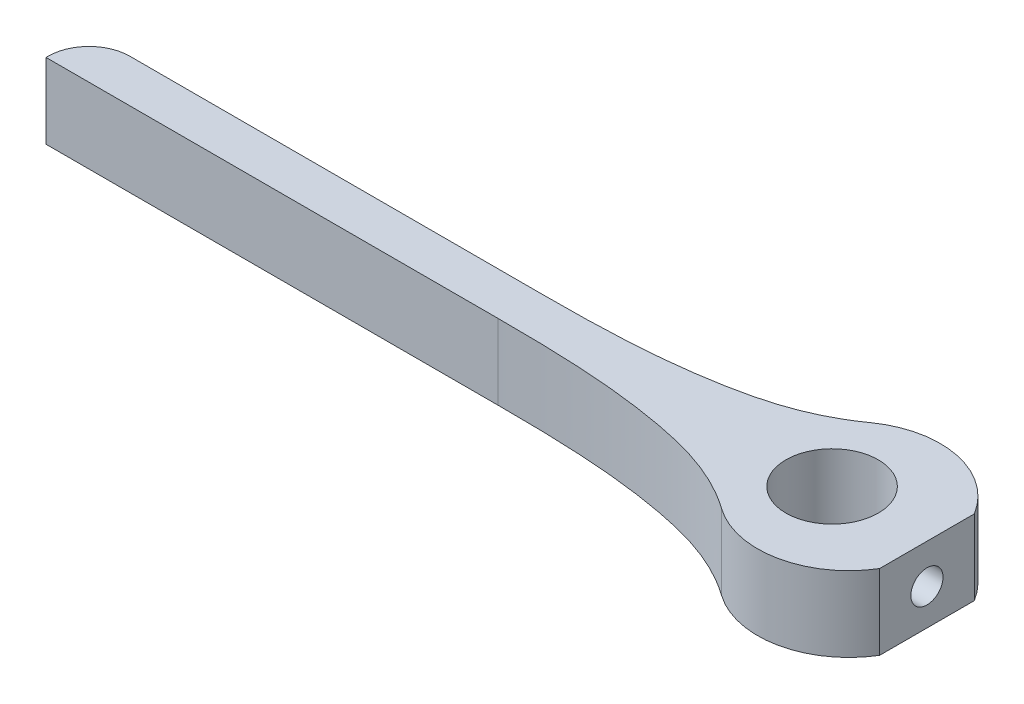
ISO-10303-21;
HEADER;
FILE_DESCRIPTION(('STEP AP214'),'2;1');
FILE_NAME('part.step','',(''),(''),'','','');
FILE_SCHEMA(('AUTOMOTIVE_DESIGN { 1 0 10303 214 1 1 1 1 }'));
ENDSEC;
DATA;
#1=APPLICATION_CONTEXT('core data for automotive mechanical design processes');
#2=APPLICATION_PROTOCOL_DEFINITION('international standard','automotive_design',2000,#1);
#3=PRODUCT_CONTEXT('',#1,'mechanical');
#4=PRODUCT('Part','Part','',(#3));
#5=PRODUCT_RELATED_PRODUCT_CATEGORY('part','',(#4));
#6=PRODUCT_DEFINITION_FORMATION('','',#4);
#7=PRODUCT_DEFINITION_CONTEXT('part definition',#1,'design');
#8=PRODUCT_DEFINITION('design','',#6,#7);
#9=PRODUCT_DEFINITION_SHAPE('','',#8);
#10=(LENGTH_UNIT() NAMED_UNIT(*) SI_UNIT(.MILLI.,.METRE.));
#11=(NAMED_UNIT(*) PLANE_ANGLE_UNIT() SI_UNIT($,.RADIAN.));
#12=(NAMED_UNIT(*) SI_UNIT($,.STERADIAN.) SOLID_ANGLE_UNIT());
#13=UNCERTAINTY_MEASURE_WITH_UNIT(LENGTH_MEASURE(1.E-05),#10,'distance_accuracy_value','');
#14=(GEOMETRIC_REPRESENTATION_CONTEXT(3) GLOBAL_UNCERTAINTY_ASSIGNED_CONTEXT((#13)) GLOBAL_UNIT_ASSIGNED_CONTEXT((#10,
#11,#12)) REPRESENTATION_CONTEXT('',''));
#15=CARTESIAN_POINT('',(0.,0.,0.));
#16=DIRECTION('',(0.,0.,1.));
#17=DIRECTION('',(1.,0.,0.));
#18=AXIS2_PLACEMENT_3D('',#15,#16,#17);
#19=CARTESIAN_POINT('',(0.,7.,0.));
#20=DIRECTION('',(0.,-1.,0.));
#21=DIRECTION('',(0.,0.,-1.));
#22=AXIS2_PLACEMENT_3D('',#19,#20,#21);
#23=CYLINDRICAL_SURFACE('',#22,4.3);
#24=CARTESIAN_POINT('',(0.,0.,0.));
#25=DIRECTION('',(0.,1.,0.));
#26=DIRECTION('',(0.,0.,1.));
#27=AXIS2_PLACEMENT_3D('',#24,#25,#26);
#28=CIRCLE('',#27,4.3);
#29=CARTESIAN_POINT('',(0.,0.,4.3));
#30=VERTEX_POINT('',#29);
#31=EDGE_CURVE('E150',#30,#30,#28,.T.);
#32=ORIENTED_EDGE('',*,*,#31,.F.);
#33=EDGE_LOOP('',(#32));
#34=FACE_BOUND('',#33,.T.);
#35=CARTESIAN_POINT('',(0.,7.,0.));
#36=DIRECTION('',(0.,1.,0.));
#37=DIRECTION('',(0.,0.,1.));
#38=AXIS2_PLACEMENT_3D('',#35,#36,#37);
#39=CIRCLE('',#38,4.3);
#40=CARTESIAN_POINT('',(0.,7.,4.3));
#41=VERTEX_POINT('',#40);
#42=EDGE_CURVE('E184',#41,#41,#39,.T.);
#43=ORIENTED_EDGE('',*,*,#42,.T.);
#44=EDGE_LOOP('',(#43));
#45=FACE_BOUND('',#44,.T.);
#46=CARTESIAN_POINT('',(0.,8.95497814287192,0.));
#47=DIRECTION('',(0.,-0.499999999999999,-0.866025403784439));
#48=DIRECTION('',(0.,-0.866025403784439,0.5));
#49=AXIS2_PLACEMENT_3D('',#46,#47,#48);
#50=ELLIPSE('',#49,8.60000000000001,4.3);
#51=CARTESIAN_POINT('',(3.98498738923209,6.1568311626395,1.61551091226932));
#52=VERTEX_POINT('',#51);
#53=CARTESIAN_POINT('',(2.83733994603308,3.35868418240708,3.23102182453865));
#54=VERTEX_POINT('',#53);
#55=EDGE_CURVE('E201',#52,#54,#50,.T.);
#56=ORIENTED_EDGE('',*,*,#55,.T.);
#57=CARTESIAN_POINT('',(0.,-2.23760977805774,0.));
#58=DIRECTION('',(0.,0.5,-0.866025403784439));
#59=DIRECTION('',(0.,-0.866025403784439,-0.5));
#60=AXIS2_PLACEMENT_3D('',#57,#58,#59);
#61=ELLIPSE('',#60,8.6,4.3);
#62=CARTESIAN_POINT('',(3.98498738923208,0.560537202174673,1.61551091226932));
#63=VERTEX_POINT('',#62);
#64=EDGE_CURVE('E11',#54,#63,#61,.T.);
#65=ORIENTED_EDGE('',*,*,#64,.T.);
#66=CARTESIAN_POINT('',(0.,0.560537202174673,0.));
#67=DIRECTION('',(0.,1.,0.));
#68=DIRECTION('',(0.,0.,1.));
#69=AXIS2_PLACEMENT_3D('',#66,#67,#68);
#70=CIRCLE('',#69,4.3);
#71=CARTESIAN_POINT('',(3.98498738923209,0.560537202174673,-1.61551091226932));
#72=VERTEX_POINT('',#71);
#73=EDGE_CURVE('E42',#63,#72,#70,.T.);
#74=ORIENTED_EDGE('',*,*,#73,.T.);
#75=CARTESIAN_POINT('',(0.,-2.23760977805774,0.));
#76=DIRECTION('',(0.,0.499999999999999,0.866025403784439));
#77=DIRECTION('',(0.,-0.866025403784439,0.5));
#78=AXIS2_PLACEMENT_3D('',#75,#76,#77);
#79=ELLIPSE('',#78,8.60000000000001,4.3);
#80=CARTESIAN_POINT('',(2.83733994603308,3.35868418240709,-3.23102182453864));
#81=VERTEX_POINT('',#80);
#82=EDGE_CURVE('E214',#72,#81,#79,.T.);
#83=ORIENTED_EDGE('',*,*,#82,.T.);
#84=CARTESIAN_POINT('',(0.,8.9549781428719,0.));
#85=DIRECTION('',(0.,-0.5,0.866025403784438));
#86=DIRECTION('',(0.,-0.866025403784439,-0.5));
#87=AXIS2_PLACEMENT_3D('',#84,#85,#86);
#88=ELLIPSE('',#87,8.6,4.3);
#89=CARTESIAN_POINT('',(3.98498738923209,6.1568311626395,-1.61551091226932));
#90=VERTEX_POINT('',#89);
#91=EDGE_CURVE('E211',#81,#90,#88,.T.);
#92=ORIENTED_EDGE('',*,*,#91,.T.);
#93=CARTESIAN_POINT('',(0.,6.1568311626395,0.));
#94=DIRECTION('',(0.,-1.,0.));
#95=DIRECTION('',(0.,0.,-1.));
#96=AXIS2_PLACEMENT_3D('',#93,#94,#95);
#97=CIRCLE('',#96,4.3);
#98=EDGE_CURVE('E208',#90,#52,#97,.T.);
#99=ORIENTED_EDGE('',*,*,#98,.T.);
#100=EDGE_LOOP('',(#56,#65,#74,#83,#92,#99));
#101=FACE_BOUND('',#100,.T.);
#102=ADVANCED_FACE('F35',(#34,#45,#101),#23,.F.);
#103=CARTESIAN_POINT('',(0.,7.,2.00000000000002));
#104=DIRECTION('',(0.,0.,-1.));
#105=DIRECTION('',(-1.,0.,0.));
#106=AXIS2_PLACEMENT_3D('',#103,#104,#105);
#107=PLANE('',#106);
#108=DIRECTION('',(1.,0.,0.));
#109=VECTOR('',#108,1.);
#110=CARTESIAN_POINT('',(0.,0.,2.00000000000002));
#111=LINE('',#110,#109);
#112=CARTESIAN_POINT('',(-71.1704335355529,0.,2.00000000000002));
#113=VERTEX_POINT('',#112);
#114=CARTESIAN_POINT('',(-29.0823518773819,0.,2.00000000000002));
#115=VERTEX_POINT('',#114);
#116=EDGE_CURVE('E153',#113,#115,#111,.T.);
#117=ORIENTED_EDGE('',*,*,#116,.T.);
#118=DIRECTION('',(0.,-1.,0.));
#119=VECTOR('',#118,1.);
#120=CARTESIAN_POINT('',(-29.0823518773819,7.,2.00000000000002));
#121=LINE('',#120,#119);
#122=CARTESIAN_POINT('',(-29.0823518773819,7.,2.00000000000002));
#123=VERTEX_POINT('',#122);
#124=EDGE_CURVE('E199',#123,#115,#121,.T.);
#125=ORIENTED_EDGE('',*,*,#124,.F.);
#126=DIRECTION('',(1.,0.,0.));
#127=VECTOR('',#126,1.);
#128=CARTESIAN_POINT('',(0.,7.,2.00000000000002));
#129=LINE('',#128,#127);
#130=CARTESIAN_POINT('',(-71.1704335355529,7.,2.00000000000002));
#131=VERTEX_POINT('',#130);
#132=EDGE_CURVE('E245',#131,#123,#129,.T.);
#133=ORIENTED_EDGE('',*,*,#132,.F.);
#134=DIRECTION('',(0.,-1.,0.));
#135=VECTOR('',#134,1.);
#136=CARTESIAN_POINT('',(-71.1704335355529,7.,2.00000000000002));
#137=LINE('',#136,#135);
#138=EDGE_CURVE('E58',#131,#113,#137,.T.);
#139=ORIENTED_EDGE('',*,*,#138,.T.);
#140=EDGE_LOOP('',(#117,#125,#133,#139));
#141=FACE_BOUND('',#140,.T.);
#142=ADVANCED_FACE('F261',(#141),#107,.F.);
#143=CARTESIAN_POINT('',(-29.0823518773819,7.,2.00000000000002));
#144=CARTESIAN_POINT('',(-23.6096498467728,7.,2.00000000000002));
#145=CARTESIAN_POINT('',(-15.2454387084048,7.,2.23858453605684));
#146=CARTESIAN_POINT('',(-6.62782454602195,7.,4.60395325455147));
#147=CARTESIAN_POINT('',(-3.36619415968429,7.,6.92522468078164));
#148=B_SPLINE_CURVE_WITH_KNOTS('',3,(#143,#144,#145,#146,#147),.UNSPECIFIED.,.F.,.F.,(4,1,4),
(0.,0.607849165272766,1.),.UNSPECIFIED.);
#149=DIRECTION('',(0.,-1.,0.));
#150=VECTOR('',#149,1.);
#151=SURFACE_OF_LINEAR_EXTRUSION('',#148,#150);
#152=CARTESIAN_POINT('',(-29.0823518773819,0.,2.00000000000002));
#153=CARTESIAN_POINT('',(-23.6096498467728,0.,2.00000000000002));
#154=CARTESIAN_POINT('',(-15.2454387084048,0.,2.23858453605684));
#155=CARTESIAN_POINT('',(-6.62782454602195,0.,4.60395325455147));
#156=CARTESIAN_POINT('',(-3.36619415968429,0.,6.92522468078164));
#157=B_SPLINE_CURVE_WITH_KNOTS('',3,(#152,#153,#154,#155,#156),.UNSPECIFIED.,.F.,.F.,(4,1,4),
(0.,0.607849165272766,1.),.UNSPECIFIED.);
#158=CARTESIAN_POINT('',(-3.3661941596843,0.,6.92522468078163));
#159=VERTEX_POINT('',#158);
#160=EDGE_CURVE('E156',#115,#159,#157,.T.);
#161=ORIENTED_EDGE('',*,*,#160,.T.);
#162=DIRECTION('',(0.,-1.,0.));
#163=VECTOR('',#162,1.);
#164=CARTESIAN_POINT('',(-3.3661941596843,7.,6.92522468078163));
#165=LINE('',#164,#163);
#166=CARTESIAN_POINT('',(-3.3661941596843,7.,6.92522468078163));
#167=VERTEX_POINT('',#166);
#168=EDGE_CURVE('E196',#167,#159,#165,.T.);
#169=ORIENTED_EDGE('',*,*,#168,.F.);
#170=EDGE_CURVE('E101',#123,#167,#148,.T.);
#171=ORIENTED_EDGE('',*,*,#170,.F.);
#172=ORIENTED_EDGE('',*,*,#124,.T.);
#173=EDGE_LOOP('',(#161,#169,#171,#172));
#174=FACE_BOUND('',#173,.T.);
#175=ADVANCED_FACE('F257',(#174),#151,.F.);
#176=CARTESIAN_POINT('',(1.56242259562272,7.,0.));
#177=DIRECTION('',(0.,-1.,0.));
#178=DIRECTION('',(0.,0.,-1.));
#179=AXIS2_PLACEMENT_3D('',#176,#177,#178);
#180=CYLINDRICAL_SURFACE('',#179,8.5);
#181=CARTESIAN_POINT('',(1.56242259562272,0.,0.));
#182=DIRECTION('',(0.,1.,0.));
#183=DIRECTION('',(0.,0.,1.));
#184=AXIS2_PLACEMENT_3D('',#181,#182,#183);
#185=CIRCLE('',#184,8.5);
#186=CARTESIAN_POINT('',(8.82956646444709,0.,4.40892503789853));
#187=VERTEX_POINT('',#186);
#188=EDGE_CURVE('E160',#159,#187,#185,.T.);
#189=ORIENTED_EDGE('',*,*,#188,.T.);
#190=DIRECTION('',(0.,-1.,0.));
#191=VECTOR('',#190,1.);
#192=CARTESIAN_POINT('',(8.82956646444709,7.,4.40892503789853));
#193=LINE('',#192,#191);
#194=CARTESIAN_POINT('',(8.82956646444709,7.,4.40892503789853));
#195=VERTEX_POINT('',#194);
#196=EDGE_CURVE('E193',#195,#187,#193,.T.);
#197=ORIENTED_EDGE('',*,*,#196,.F.);
#198=CARTESIAN_POINT('',(1.56242259562272,7.,0.));
#199=DIRECTION('',(0.,1.,0.));
#200=DIRECTION('',(0.,0.,1.));
#201=AXIS2_PLACEMENT_3D('',#198,#199,#200);
#202=CIRCLE('',#201,8.5);
#203=EDGE_CURVE('E251',#167,#195,#202,.T.);
#204=ORIENTED_EDGE('',*,*,#203,.F.);
#205=ORIENTED_EDGE('',*,*,#168,.T.);
#206=EDGE_LOOP('',(#189,#197,#204,#205));
#207=FACE_BOUND('',#206,.T.);
#208=ADVANCED_FACE('F260',(#207),#180,.T.);
#209=CARTESIAN_POINT('',(8.82956646444709,7.,0.));
#210=DIRECTION('',(-1.,0.,0.));
#211=DIRECTION('',(0.,0.,1.));
#212=AXIS2_PLACEMENT_3D('',#209,#210,#211);
#213=PLANE('',#212);
#214=CARTESIAN_POINT('',(8.82956646444709,3.35868418240709,0.));
#215=DIRECTION('',(1.,0.,0.));
#216=DIRECTION('',(0.,0.,-1.));
#217=AXIS2_PLACEMENT_3D('',#214,#215,#216);
#218=CIRCLE('',#217,1.49628512745649);
#219=CARTESIAN_POINT('',(8.82956646444709,3.35868418240709,-1.49628512745649));
#220=VERTEX_POINT('',#219);
#221=EDGE_CURVE('E154',#220,#220,#218,.T.);
#222=ORIENTED_EDGE('',*,*,#221,.F.);
#223=EDGE_LOOP('',(#222));
#224=FACE_BOUND('',#223,.T.);
#225=DIRECTION('',(0.,0.,-1.));
#226=VECTOR('',#225,1.);
#227=CARTESIAN_POINT('',(8.82956646444709,0.,0.));
#228=LINE('',#227,#226);
#229=CARTESIAN_POINT('',(8.82956646444709,0.,-4.40892503789851));
#230=VERTEX_POINT('',#229);
#231=EDGE_CURVE('E165',#187,#230,#228,.T.);
#232=ORIENTED_EDGE('',*,*,#231,.T.);
#233=DIRECTION('',(0.,-1.,0.));
#234=VECTOR('',#233,1.);
#235=CARTESIAN_POINT('',(8.82956646444709,7.,-4.40892503789851));
#236=LINE('',#235,#234);
#237=CARTESIAN_POINT('',(8.82956646444709,7.,-4.40892503789851));
#238=VERTEX_POINT('',#237);
#239=EDGE_CURVE('E190',#238,#230,#236,.T.);
#240=ORIENTED_EDGE('',*,*,#239,.F.);
#241=DIRECTION('',(0.,0.,-1.));
#242=VECTOR('',#241,1.);
#243=CARTESIAN_POINT('',(8.82956646444709,7.,0.));
#244=LINE('',#243,#242);
#245=EDGE_CURVE('E287',#195,#238,#244,.T.);
#246=ORIENTED_EDGE('',*,*,#245,.F.);
#247=ORIENTED_EDGE('',*,*,#196,.T.);
#248=EDGE_LOOP('',(#232,#240,#246,#247));
#249=FACE_BOUND('',#248,.T.);
#250=ADVANCED_FACE('F286',(#224,#249),#213,.F.);
#251=CARTESIAN_POINT('',(1.56242259562272,7.,0.));
#252=DIRECTION('',(0.,-1.,0.));
#253=DIRECTION('',(0.,0.,-1.));
#254=AXIS2_PLACEMENT_3D('',#251,#252,#253);
#255=CYLINDRICAL_SURFACE('',#254,8.5);
#256=CARTESIAN_POINT('',(1.56242259562272,0.,0.));
#257=DIRECTION('',(0.,1.,0.));
#258=DIRECTION('',(0.,0.,1.));
#259=AXIS2_PLACEMENT_3D('',#256,#257,#258);
#260=CIRCLE('',#259,8.5);
#261=CARTESIAN_POINT('',(-3.36619415968427,0.,-6.92522468078163));
#262=VERTEX_POINT('',#261);
#263=EDGE_CURVE('E167',#230,#262,#260,.T.);
#264=ORIENTED_EDGE('',*,*,#263,.T.);
#265=DIRECTION('',(0.,-1.,0.));
#266=VECTOR('',#265,1.);
#267=CARTESIAN_POINT('',(-3.36619415968427,7.,-6.92522468078163));
#268=LINE('',#267,#266);
#269=CARTESIAN_POINT('',(-3.36619415968427,7.,-6.92522468078163));
#270=VERTEX_POINT('',#269);
#271=EDGE_CURVE('E188',#270,#262,#268,.T.);
#272=ORIENTED_EDGE('',*,*,#271,.F.);
#273=CARTESIAN_POINT('',(1.56242259562272,7.,0.));
#274=DIRECTION('',(0.,1.,0.));
#275=DIRECTION('',(0.,0.,1.));
#276=AXIS2_PLACEMENT_3D('',#273,#274,#275);
#277=CIRCLE('',#276,8.5);
#278=EDGE_CURVE('E283',#238,#270,#277,.T.);
#279=ORIENTED_EDGE('',*,*,#278,.F.);
#280=ORIENTED_EDGE('',*,*,#239,.T.);
#281=EDGE_LOOP('',(#264,#272,#279,#280));
#282=FACE_BOUND('',#281,.T.);
#283=ADVANCED_FACE('F281',(#282),#255,.T.);
#284=CARTESIAN_POINT('',(-29.0823518773819,7.,-1.99999999999998));
#285=CARTESIAN_POINT('',(-23.6096498467728,7.,-1.99999999999998));
#286=CARTESIAN_POINT('',(-15.2454387084047,7.,-2.23858453605683));
#287=CARTESIAN_POINT('',(-6.62782454602194,7.,-4.60395325455147));
#288=CARTESIAN_POINT('',(-3.36619415968426,7.,-6.92522468078163));
#289=B_SPLINE_CURVE_WITH_KNOTS('',3,(#284,#285,#286,#287,#288),.UNSPECIFIED.,.F.,.F.,(4,1,4),
(0.,0.607849165272766,1.),.UNSPECIFIED.);
#290=DIRECTION('',(0.,-1.,0.));
#291=VECTOR('',#290,1.);
#292=SURFACE_OF_LINEAR_EXTRUSION('',#289,#291);
#293=CARTESIAN_POINT('',(-29.0823518773819,0.,-1.99999999999998));
#294=CARTESIAN_POINT('',(-23.6096498467728,0.,-1.99999999999998));
#295=CARTESIAN_POINT('',(-15.2454387084047,0.,-2.23858453605683));
#296=CARTESIAN_POINT('',(-6.62782454602194,0.,-4.60395325455147));
#297=CARTESIAN_POINT('',(-3.36619415968426,0.,-6.92522468078163));
#298=B_SPLINE_CURVE_WITH_KNOTS('',3,(#293,#294,#295,#296,#297),.UNSPECIFIED.,.F.,.F.,(4,1,4),
(0.,0.607849165272766,1.),.UNSPECIFIED.);
#299=CARTESIAN_POINT('',(-29.0823518773819,0.,-1.99999999999998));
#300=VERTEX_POINT('',#299);
#301=EDGE_CURVE('E170',#300,#262,#298,.T.);
#302=ORIENTED_EDGE('',*,*,#301,.F.);
#303=DIRECTION('',(0.,-1.,0.));
#304=VECTOR('',#303,1.);
#305=CARTESIAN_POINT('',(-29.0823518773819,7.,-1.99999999999998));
#306=LINE('',#305,#304);
#307=CARTESIAN_POINT('',(-29.0823518773819,7.,-1.99999999999998));
#308=VERTEX_POINT('',#307);
#309=EDGE_CURVE('E132',#308,#300,#306,.T.);
#310=ORIENTED_EDGE('',*,*,#309,.F.);
#311=EDGE_CURVE('E142',#308,#270,#289,.T.);
#312=ORIENTED_EDGE('',*,*,#311,.T.);
#313=ORIENTED_EDGE('',*,*,#271,.T.);
#314=EDGE_LOOP('',(#302,#310,#312,#313));
#315=FACE_BOUND('',#314,.T.);
#316=ADVANCED_FACE('F277',(#315),#292,.T.);
#317=CARTESIAN_POINT('',(0.,7.,-1.99999999999998));
#318=DIRECTION('',(0.,0.,-1.));
#319=DIRECTION('',(-1.,0.,0.));
#320=AXIS2_PLACEMENT_3D('',#317,#318,#319);
#321=PLANE('',#320);
#322=DIRECTION('',(1.,0.,0.));
#323=VECTOR('',#322,1.);
#324=CARTESIAN_POINT('',(0.,0.,-1.99999999999998));
#325=LINE('',#324,#323);
#326=CARTESIAN_POINT('',(-67.3704335355529,0.,-1.99999999999998));
#327=VERTEX_POINT('',#326);
#328=EDGE_CURVE('E127',#327,#300,#325,.T.);
#329=ORIENTED_EDGE('',*,*,#328,.F.);
#330=DIRECTION('',(0.,-1.,0.));
#331=VECTOR('',#330,1.);
#332=CARTESIAN_POINT('',(-67.3704335355529,7.,-1.99999999999998));
#333=LINE('',#332,#331);
#334=CARTESIAN_POINT('',(-67.3704335355529,7.,-1.99999999999998));
#335=VERTEX_POINT('',#334);
#336=EDGE_CURVE('E122',#335,#327,#333,.T.);
#337=ORIENTED_EDGE('',*,*,#336,.F.);
#338=DIRECTION('',(1.,0.,0.));
#339=VECTOR('',#338,1.);
#340=CARTESIAN_POINT('',(0.,7.,-1.99999999999998));
#341=LINE('',#340,#339);
#342=EDGE_CURVE('E125',#335,#308,#341,.T.);
#343=ORIENTED_EDGE('',*,*,#342,.T.);
#344=ORIENTED_EDGE('',*,*,#309,.T.);
#345=EDGE_LOOP('',(#329,#337,#343,#344));
#346=FACE_BOUND('',#345,.T.);
#347=ADVANCED_FACE('F124',(#346),#321,.T.);
#348=CARTESIAN_POINT('',(-67.3704335355529,7.,1.80000000000002));
#349=DIRECTION('',(0.,-1.,0.));
#350=DIRECTION('',(0.,0.,-1.));
#351=AXIS2_PLACEMENT_3D('',#348,#349,#350);
#352=CYLINDRICAL_SURFACE('',#351,3.8);
#353=CARTESIAN_POINT('',(-67.3704335355529,0.,1.80000000000002));
#354=DIRECTION('',(0.,1.,0.));
#355=DIRECTION('',(0.,0.,1.));
#356=AXIS2_PLACEMENT_3D('',#353,#354,#355);
#357=CIRCLE('',#356,3.8);
#358=CARTESIAN_POINT('',(-71.1704335355529,0.,1.80000000000004));
#359=VERTEX_POINT('',#358);
#360=EDGE_CURVE('E179',#359,#327,#357,.F.);
#361=ORIENTED_EDGE('',*,*,#360,.F.);
#362=DIRECTION('',(0.,-1.,0.));
#363=VECTOR('',#362,1.);
#364=CARTESIAN_POINT('',(-71.1704335355529,7.,1.80000000000004));
#365=LINE('',#364,#363);
#366=CARTESIAN_POINT('',(-71.1704335355529,7.,1.80000000000004));
#367=VERTEX_POINT('',#366);
#368=EDGE_CURVE('E133',#367,#359,#365,.T.);
#369=ORIENTED_EDGE('',*,*,#368,.F.);
#370=CARTESIAN_POINT('',(-67.3704335355529,7.,1.80000000000002));
#371=DIRECTION('',(0.,1.,0.));
#372=DIRECTION('',(0.,0.,1.));
#373=AXIS2_PLACEMENT_3D('',#370,#371,#372);
#374=CIRCLE('',#373,3.8);
#375=EDGE_CURVE('E140',#367,#335,#374,.F.);
#376=ORIENTED_EDGE('',*,*,#375,.T.);
#377=ORIENTED_EDGE('',*,*,#336,.T.);
#378=EDGE_LOOP('',(#361,#369,#376,#377));
#379=FACE_BOUND('',#378,.T.);
#380=ADVANCED_FACE('F144',(#379),#352,.T.);
#381=CARTESIAN_POINT('',(-71.1704335355529,7.,0.));
#382=DIRECTION('',(-1.,0.,0.));
#383=DIRECTION('',(0.,0.,1.));
#384=AXIS2_PLACEMENT_3D('',#381,#382,#383);
#385=PLANE('',#384);
#386=DIRECTION('',(0.,0.,-1.));
#387=VECTOR('',#386,1.);
#388=CARTESIAN_POINT('',(-71.1704335355529,0.,0.));
#389=LINE('',#388,#387);
#390=EDGE_CURVE('E181',#113,#359,#389,.T.);
#391=ORIENTED_EDGE('',*,*,#390,.F.);
#392=ORIENTED_EDGE('',*,*,#138,.F.);
#393=DIRECTION('',(0.,0.,-1.));
#394=VECTOR('',#393,1.);
#395=CARTESIAN_POINT('',(-71.1704335355529,7.,0.));
#396=LINE('',#395,#394);
#397=EDGE_CURVE('E145',#131,#367,#396,.T.);
#398=ORIENTED_EDGE('',*,*,#397,.T.);
#399=ORIENTED_EDGE('',*,*,#368,.T.);
#400=EDGE_LOOP('',(#391,#392,#398,#399));
#401=FACE_BOUND('',#400,.T.);
#402=ADVANCED_FACE('F272',(#401),#385,.T.);
#403=CARTESIAN_POINT('',(0.,7.,0.));
#404=DIRECTION('',(0.,1.,0.));
#405=DIRECTION('',(0.,0.,1.));
#406=AXIS2_PLACEMENT_3D('',#403,#404,#405);
#407=PLANE('',#406);
#408=ORIENTED_EDGE('',*,*,#42,.F.);
#409=EDGE_LOOP('',(#408));
#410=FACE_BOUND('',#409,.T.);
#411=ORIENTED_EDGE('',*,*,#132,.T.);
#412=ORIENTED_EDGE('',*,*,#170,.T.);
#413=ORIENTED_EDGE('',*,*,#203,.T.);
#414=ORIENTED_EDGE('',*,*,#245,.T.);
#415=ORIENTED_EDGE('',*,*,#278,.T.);
#416=ORIENTED_EDGE('',*,*,#311,.F.);
#417=ORIENTED_EDGE('',*,*,#342,.F.);
#418=ORIENTED_EDGE('',*,*,#375,.F.);
#419=ORIENTED_EDGE('',*,*,#397,.F.);
#420=EDGE_LOOP('',(#411,#412,#413,#414,#415,#416,#417,#418,#419));
#421=FACE_BOUND('',#420,.T.);
#422=ADVANCED_FACE('F138',(#410,#421),#407,.T.);
#423=CARTESIAN_POINT('',(0.,0.,0.));
#424=DIRECTION('',(0.,1.,0.));
#425=DIRECTION('',(0.,0.,1.));
#426=AXIS2_PLACEMENT_3D('',#423,#424,#425);
#427=PLANE('',#426);
#428=ORIENTED_EDGE('',*,*,#31,.T.);
#429=EDGE_LOOP('',(#428));
#430=FACE_BOUND('',#429,.T.);
#431=ORIENTED_EDGE('',*,*,#116,.F.);
#432=ORIENTED_EDGE('',*,*,#390,.T.);
#433=ORIENTED_EDGE('',*,*,#360,.T.);
#434=ORIENTED_EDGE('',*,*,#328,.T.);
#435=ORIENTED_EDGE('',*,*,#301,.T.);
#436=ORIENTED_EDGE('',*,*,#263,.F.);
#437=ORIENTED_EDGE('',*,*,#231,.F.);
#438=ORIENTED_EDGE('',*,*,#188,.F.);
#439=ORIENTED_EDGE('',*,*,#160,.F.);
#440=EDGE_LOOP('',(#431,#432,#433,#434,#435,#436,#437,#438,#439));
#441=FACE_BOUND('',#440,.T.);
#442=ADVANCED_FACE('F270',(#430,#441),#427,.F.);
#443=CARTESIAN_POINT('',(-71.1714335355529,3.35868418240709,0.));
#444=DIRECTION('',(1.,0.,0.));
#445=DIRECTION('',(0.,0.,-1.));
#446=AXIS2_PLACEMENT_3D('',#443,#444,#445);
#447=CYLINDRICAL_SURFACE('',#446,1.49628512745649);
#448=CARTESIAN_POINT('',(6.32956646444709,3.35868418240709,0.));
#449=DIRECTION('',(1.,0.,0.));
#450=DIRECTION('',(0.,0.,-1.));
#451=AXIS2_PLACEMENT_3D('',#448,#449,#450);
#452=CIRCLE('',#451,1.49628512745649);
#453=CARTESIAN_POINT('',(6.32956646444709,3.35868418240709,-1.49628512745649));
#454=VERTEX_POINT('',#453);
#455=EDGE_CURVE('E202',#454,#454,#452,.F.);
#456=ORIENTED_EDGE('',*,*,#455,.T.);
#457=EDGE_LOOP('',(#456));
#458=FACE_BOUND('',#457,.T.);
#459=ORIENTED_EDGE('',*,*,#221,.T.);
#460=EDGE_LOOP('',(#459));
#461=FACE_BOUND('',#460,.T.);
#462=ADVANCED_FACE('F311',(#458,#461),#447,.F.);
#463=CARTESIAN_POINT('',(6.32956646444709,0.,0.));
#464=DIRECTION('',(1.,0.,0.));
#465=DIRECTION('',(0.,0.,-1.));
#466=AXIS2_PLACEMENT_3D('',#463,#464,#465);
#467=PLANE('',#466);
#468=DIRECTION('',(0.,-0.866025403784438,-0.5));
#469=VECTOR('',#468,1.);
#470=CARTESIAN_POINT('',(6.32956646444709,3.35868418240708,3.23102182453864));
#471=LINE('',#470,#469);
#472=CARTESIAN_POINT('',(6.32956646444709,3.35868418240708,3.23102182453864));
#473=VERTEX_POINT('',#472);
#474=CARTESIAN_POINT('',(6.32956646444709,0.560537202174673,1.61551091226932));
#475=VERTEX_POINT('',#474);
#476=EDGE_CURVE('E235',#473,#475,#471,.T.);
#477=ORIENTED_EDGE('',*,*,#476,.F.);
#478=DIRECTION('',(0.,-0.866025403784439,0.499999999999999));
#479=VECTOR('',#478,1.);
#480=CARTESIAN_POINT('',(6.32956646444709,6.1568311626395,1.61551091226932));
#481=LINE('',#480,#479);
#482=CARTESIAN_POINT('',(6.32956646444709,6.1568311626395,1.61551091226932));
#483=VERTEX_POINT('',#482);
#484=EDGE_CURVE('E448',#483,#473,#481,.T.);
#485=ORIENTED_EDGE('',*,*,#484,.F.);
#486=DIRECTION('',(0.,0.,1.));
#487=VECTOR('',#486,1.);
#488=CARTESIAN_POINT('',(6.32956646444709,6.1568311626395,-1.61551091226932));
#489=LINE('',#488,#487);
#490=CARTESIAN_POINT('',(6.32956646444709,6.1568311626395,-1.61551091226932));
#491=VERTEX_POINT('',#490);
#492=EDGE_CURVE('E459',#491,#483,#489,.T.);
#493=ORIENTED_EDGE('',*,*,#492,.F.);
#494=DIRECTION('',(0.,0.866025403784438,0.5));
#495=VECTOR('',#494,1.);
#496=CARTESIAN_POINT('',(6.32956646444709,3.35868418240709,-3.23102182453864));
#497=LINE('',#496,#495);
#498=CARTESIAN_POINT('',(6.32956646444709,3.35868418240709,-3.23102182453864));
#499=VERTEX_POINT('',#498);
#500=EDGE_CURVE('E463',#499,#491,#497,.T.);
#501=ORIENTED_EDGE('',*,*,#500,.F.);
#502=DIRECTION('',(0.,0.866025403784439,-0.5));
#503=VECTOR('',#502,1.);
#504=CARTESIAN_POINT('',(6.32956646444709,0.560537202174673,-1.61551091226932));
#505=LINE('',#504,#503);
#506=CARTESIAN_POINT('',(6.32956646444709,0.560537202174673,-1.61551091226932));
#507=VERTEX_POINT('',#506);
#508=EDGE_CURVE('E473',#507,#499,#505,.T.);
#509=ORIENTED_EDGE('',*,*,#508,.F.);
#510=DIRECTION('',(0.,0.,-1.));
#511=VECTOR('',#510,1.);
#512=CARTESIAN_POINT('',(6.32956646444709,0.560537202174673,1.61551091226932));
#513=LINE('',#512,#511);
#514=EDGE_CURVE('E481',#475,#507,#513,.T.);
#515=ORIENTED_EDGE('',*,*,#514,.F.);
#516=EDGE_LOOP('',(#477,#485,#493,#501,#509,#515));
#517=FACE_BOUND('',#516,.T.);
#518=ORIENTED_EDGE('',*,*,#455,.F.);
#519=EDGE_LOOP('',(#518));
#520=FACE_BOUND('',#519,.T.);
#521=ADVANCED_FACE('F313',(#517,#520),#467,.F.);
#522=CARTESIAN_POINT('',(6.32956646444709,3.35868418240708,3.23102182453864));
#523=DIRECTION('',(0.,0.5,-0.866025403784439));
#524=DIRECTION('',(0.,0.866025403784439,0.5));
#525=AXIS2_PLACEMENT_3D('',#522,#523,#524);
#526=PLANE('',#525);
#527=DIRECTION('',(-1.,0.,0.));
#528=VECTOR('',#527,1.);
#529=CARTESIAN_POINT('',(6.32956646444709,3.35868418240708,3.23102182453864));
#530=LINE('',#529,#528);
#531=EDGE_CURVE('E49',#473,#54,#530,.T.);
#532=ORIENTED_EDGE('',*,*,#531,.F.);
#533=ORIENTED_EDGE('',*,*,#476,.T.);
#534=DIRECTION('',(-1.,0.,0.));
#535=VECTOR('',#534,1.);
#536=CARTESIAN_POINT('',(6.32956646444709,0.560537202174673,1.61551091226932));
#537=LINE('',#536,#535);
#538=EDGE_CURVE('E205',#475,#63,#537,.T.);
#539=ORIENTED_EDGE('',*,*,#538,.T.);
#540=ORIENTED_EDGE('',*,*,#64,.F.);
#541=EDGE_LOOP('',(#532,#533,#539,#540));
#542=FACE_BOUND('',#541,.T.);
#543=ADVANCED_FACE('F233',(#542),#526,.T.);
#544=CARTESIAN_POINT('',(6.32956646444709,0.560537202174673,1.61551091226932));
#545=DIRECTION('',(0.,1.,0.));
#546=DIRECTION('',(0.,0.,1.));
#547=AXIS2_PLACEMENT_3D('',#544,#545,#546);
#548=PLANE('',#547);
#549=ORIENTED_EDGE('',*,*,#538,.F.);
#550=ORIENTED_EDGE('',*,*,#514,.T.);
#551=DIRECTION('',(-1.,0.,0.));
#552=VECTOR('',#551,1.);
#553=CARTESIAN_POINT('',(6.32956646444709,0.560537202174673,-1.61551091226932));
#554=LINE('',#553,#552);
#555=EDGE_CURVE('E230',#507,#72,#554,.T.);
#556=ORIENTED_EDGE('',*,*,#555,.T.);
#557=ORIENTED_EDGE('',*,*,#73,.F.);
#558=EDGE_LOOP('',(#549,#550,#556,#557));
#559=FACE_BOUND('',#558,.T.);
#560=ADVANCED_FACE('F226',(#559),#548,.T.);
#561=CARTESIAN_POINT('',(6.32956646444709,0.560537202174673,-1.61551091226932));
#562=DIRECTION('',(0.,0.499999999999999,0.866025403784439));
#563=DIRECTION('',(0.,-0.866025403784439,0.5));
#564=AXIS2_PLACEMENT_3D('',#561,#562,#563);
#565=PLANE('',#564);
#566=ORIENTED_EDGE('',*,*,#555,.F.);
#567=ORIENTED_EDGE('',*,*,#508,.T.);
#568=DIRECTION('',(-1.,0.,0.));
#569=VECTOR('',#568,1.);
#570=CARTESIAN_POINT('',(6.32956646444709,3.35868418240709,-3.23102182453864));
#571=LINE('',#570,#569);
#572=EDGE_CURVE('E237',#499,#81,#571,.T.);
#573=ORIENTED_EDGE('',*,*,#572,.T.);
#574=ORIENTED_EDGE('',*,*,#82,.F.);
#575=EDGE_LOOP('',(#566,#567,#573,#574));
#576=FACE_BOUND('',#575,.T.);
#577=ADVANCED_FACE('F401',(#576),#565,.T.);
#578=CARTESIAN_POINT('',(6.32956646444709,3.35868418240709,-3.23102182453864));
#579=DIRECTION('',(0.,-0.5,0.866025403784438));
#580=DIRECTION('',(0.,-0.866025403784439,-0.5));
#581=AXIS2_PLACEMENT_3D('',#578,#579,#580);
#582=PLANE('',#581);
#583=ORIENTED_EDGE('',*,*,#572,.F.);
#584=ORIENTED_EDGE('',*,*,#500,.T.);
#585=DIRECTION('',(-1.,0.,0.));
#586=VECTOR('',#585,1.);
#587=CARTESIAN_POINT('',(6.32956646444709,6.1568311626395,-1.61551091226932));
#588=LINE('',#587,#586);
#589=EDGE_CURVE('E454',#491,#90,#588,.T.);
#590=ORIENTED_EDGE('',*,*,#589,.T.);
#591=ORIENTED_EDGE('',*,*,#91,.F.);
#592=EDGE_LOOP('',(#583,#584,#590,#591));
#593=FACE_BOUND('',#592,.T.);
#594=ADVANCED_FACE('F409',(#593),#582,.T.);
#595=CARTESIAN_POINT('',(6.32956646444709,6.1568311626395,-1.61551091226932));
#596=DIRECTION('',(0.,-1.,0.));
#597=DIRECTION('',(0.,0.,-1.));
#598=AXIS2_PLACEMENT_3D('',#595,#596,#597);
#599=PLANE('',#598);
#600=ORIENTED_EDGE('',*,*,#589,.F.);
#601=ORIENTED_EDGE('',*,*,#492,.T.);
#602=DIRECTION('',(-1.,0.,0.));
#603=VECTOR('',#602,1.);
#604=CARTESIAN_POINT('',(6.32956646444709,6.1568311626395,1.61551091226932));
#605=LINE('',#604,#603);
#606=EDGE_CURVE('E445',#483,#52,#605,.T.);
#607=ORIENTED_EDGE('',*,*,#606,.T.);
#608=ORIENTED_EDGE('',*,*,#98,.F.);
#609=EDGE_LOOP('',(#600,#601,#607,#608));
#610=FACE_BOUND('',#609,.T.);
#611=ADVANCED_FACE('F419',(#610),#599,.T.);
#612=CARTESIAN_POINT('',(6.32956646444709,6.1568311626395,1.61551091226932));
#613=DIRECTION('',(0.,-0.499999999999999,-0.866025403784439));
#614=DIRECTION('',(0.,0.866025403784439,-0.5));
#615=AXIS2_PLACEMENT_3D('',#612,#613,#614);
#616=PLANE('',#615);
#617=ORIENTED_EDGE('',*,*,#606,.F.);
#618=ORIENTED_EDGE('',*,*,#484,.T.);
#619=ORIENTED_EDGE('',*,*,#531,.T.);
#620=ORIENTED_EDGE('',*,*,#55,.F.);
#621=EDGE_LOOP('',(#617,#618,#619,#620));
#622=FACE_BOUND('',#621,.T.);
#623=ADVANCED_FACE('F429',(#622),#616,.T.);
#624=CLOSED_SHELL('',(#102,#142,#175,#208,#250,#283,#316,#347,#380,#402,#422,#442,#462,#521,
#543,#560,#577,#594,#611,#623));
#625=MANIFOLD_SOLID_BREP('B2',#624);
#626=ADVANCED_BREP_SHAPE_REPRESENTATION('',(#18,#625),#14);
#627=SHAPE_DEFINITION_REPRESENTATION(#9,#626);
ENDSEC;
END-ISO-10303-21;
